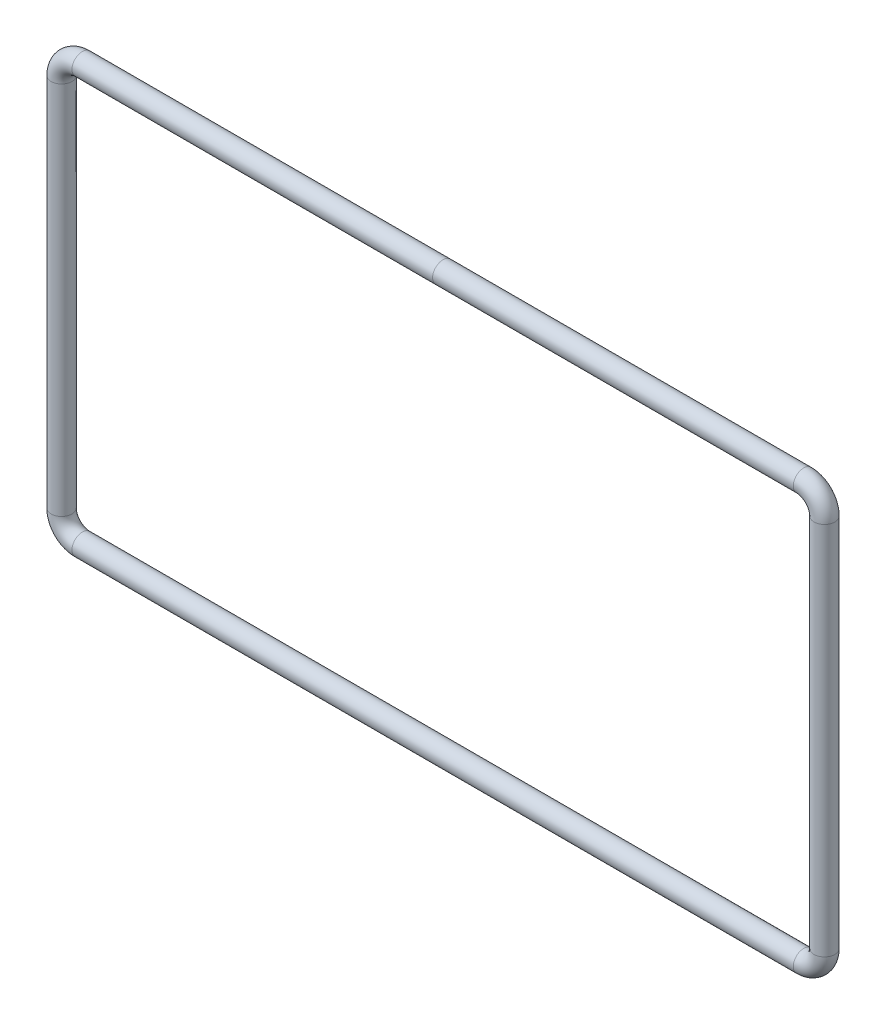
ISO-10303-21;
HEADER;
FILE_DESCRIPTION(('STEP AP214'),'2;1');
FILE_NAME('part.step','',(''),(''),'','','');
FILE_SCHEMA(('AUTOMOTIVE_DESIGN { 1 0 10303 214 1 1 1 1 }'));
ENDSEC;
DATA;
#1=APPLICATION_CONTEXT('core data for automotive mechanical design processes');
#2=APPLICATION_PROTOCOL_DEFINITION('international standard','automotive_design',2000,#1);
#3=PRODUCT_CONTEXT('',#1,'mechanical');
#4=PRODUCT('Part','Part','',(#3));
#5=PRODUCT_RELATED_PRODUCT_CATEGORY('part','',(#4));
#6=PRODUCT_DEFINITION_FORMATION('','',#4);
#7=PRODUCT_DEFINITION_CONTEXT('part definition',#1,'design');
#8=PRODUCT_DEFINITION('design','',#6,#7);
#9=PRODUCT_DEFINITION_SHAPE('','',#8);
#10=(LENGTH_UNIT() NAMED_UNIT(*) SI_UNIT(.MILLI.,.METRE.));
#11=(NAMED_UNIT(*) PLANE_ANGLE_UNIT() SI_UNIT($,.RADIAN.));
#12=(NAMED_UNIT(*) SI_UNIT($,.STERADIAN.) SOLID_ANGLE_UNIT());
#13=UNCERTAINTY_MEASURE_WITH_UNIT(LENGTH_MEASURE(1.E-05),#10,'distance_accuracy_value','');
#14=(GEOMETRIC_REPRESENTATION_CONTEXT(3) GLOBAL_UNCERTAINTY_ASSIGNED_CONTEXT((#13)) GLOBAL_UNIT_ASSIGNED_CONTEXT((#10,
#11,#12)) REPRESENTATION_CONTEXT('',''));
#15=CARTESIAN_POINT('',(0.,0.,0.));
#16=DIRECTION('',(0.,0.,1.));
#17=DIRECTION('',(1.,0.,0.));
#18=AXIS2_PLACEMENT_3D('',#15,#16,#17);
#19=CARTESIAN_POINT('',(-72.8,42.,0.));
#20=DIRECTION('',(1.,0.,0.));
#21=DIRECTION('',(0.,1.,0.));
#22=AXIS2_PLACEMENT_3D('',#19,#20,#21);
#23=CYLINDRICAL_SURFACE('',#22,2.1);
#24=CARTESIAN_POINT('',(0.,42.,0.));
#25=DIRECTION('',(1.,0.,0.));
#26=DIRECTION('',(0.,0.,-1.));
#27=AXIS2_PLACEMENT_3D('',#24,#25,#26);
#28=CIRCLE('',#27,2.1);
#29=CARTESIAN_POINT('',(0.,42.,-2.1));
#30=VERTEX_POINT('',#29);
#31=EDGE_CURVE('E64',#30,#30,#28,.T.);
#32=ORIENTED_EDGE('',*,*,#31,.F.);
#33=EDGE_LOOP('',(#32));
#34=FACE_BOUND('',#33,.T.);
#35=CARTESIAN_POINT('',(-72.8,42.,0.));
#36=DIRECTION('',(1.,0.,0.));
#37=DIRECTION('',(0.,0.,-1.));
#38=AXIS2_PLACEMENT_3D('',#35,#36,#37);
#39=CIRCLE('',#38,2.1);
#40=CARTESIAN_POINT('',(-72.8,44.1,0.));
#41=VERTEX_POINT('',#40);
#42=EDGE_CURVE('E10',#41,#41,#39,.T.);
#43=ORIENTED_EDGE('',*,*,#42,.T.);
#44=EDGE_LOOP('',(#43));
#45=FACE_BOUND('',#44,.T.);
#46=ADVANCED_FACE('F33',(#34,#45),#23,.T.);
#47=CARTESIAN_POINT('',(-72.8,37.8,0.));
#48=DIRECTION('',(0.,0.,-1.));
#49=DIRECTION('',(-1.,0.,0.));
#50=AXIS2_PLACEMENT_3D('',#47,#48,#49);
#51=TOROIDAL_SURFACE('',#50,4.20000000000001,2.1);
#52=CARTESIAN_POINT('',(-77.,37.8,0.));
#53=DIRECTION('',(0.,1.,0.));
#54=DIRECTION('',(0.,0.,-1.));
#55=AXIS2_PLACEMENT_3D('',#52,#53,#54);
#56=CIRCLE('',#55,2.1);
#57=CARTESIAN_POINT('',(-79.1,37.8,0.));
#58=VERTEX_POINT('',#57);
#59=EDGE_CURVE('E39',#58,#58,#56,.T.);
#60=CARTESIAN_POINT('',(-72.8,37.8,0.));
#61=DIRECTION('',(0.,0.,-1.));
#62=DIRECTION('',(-1.,0.,0.));
#63=AXIS2_PLACEMENT_3D('',#60,#61,#62);
#64=CIRCLE('',#63,6.30000000000001);
#65=EDGE_CURVE('',#58,#41,#64,.T.);
#66=ORIENTED_EDGE('',*,*,#59,.T.);
#67=ORIENTED_EDGE('',*,*,#42,.F.);
#68=ORIENTED_EDGE('',*,*,#65,.T.);
#69=ORIENTED_EDGE('',*,*,#65,.F.);
#70=EDGE_LOOP('',(#66,#68,#67,#69));
#71=FACE_BOUND('',#70,.T.);
#72=ADVANCED_FACE('F71',(#71),#51,.T.);
#73=CARTESIAN_POINT('',(-77.,-37.8,0.));
#74=DIRECTION('',(0.,1.,0.));
#75=DIRECTION('',(-1.,0.,0.));
#76=AXIS2_PLACEMENT_3D('',#73,#74,#75);
#77=CYLINDRICAL_SURFACE('',#76,2.1);
#78=ORIENTED_EDGE('',*,*,#59,.F.);
#79=EDGE_LOOP('',(#78));
#80=FACE_BOUND('',#79,.T.);
#81=CARTESIAN_POINT('',(-77.,-37.8,0.));
#82=DIRECTION('',(0.,1.,0.));
#83=DIRECTION('',(0.,0.,-1.));
#84=AXIS2_PLACEMENT_3D('',#81,#82,#83);
#85=CIRCLE('',#84,2.1);
#86=CARTESIAN_POINT('',(-79.1,-37.8,0.));
#87=VERTEX_POINT('',#86);
#88=EDGE_CURVE('E43',#87,#87,#85,.T.);
#89=ORIENTED_EDGE('',*,*,#88,.T.);
#90=EDGE_LOOP('',(#89));
#91=FACE_BOUND('',#90,.T.);
#92=ADVANCED_FACE('F75',(#80,#91),#77,.T.);
#93=CARTESIAN_POINT('',(-72.8,-37.8,0.));
#94=DIRECTION('',(0.,0.,-1.));
#95=DIRECTION('',(-1.,0.,0.));
#96=AXIS2_PLACEMENT_3D('',#93,#94,#95);
#97=TOROIDAL_SURFACE('',#96,4.2,2.1);
#98=CARTESIAN_POINT('',(-72.8,-42.,0.));
#99=DIRECTION('',(-1.,0.,0.));
#100=DIRECTION('',(0.,0.,-1.));
#101=AXIS2_PLACEMENT_3D('',#98,#99,#100);
#102=CIRCLE('',#101,2.1);
#103=CARTESIAN_POINT('',(-72.8,-44.1,0.));
#104=VERTEX_POINT('',#103);
#105=EDGE_CURVE('E47',#104,#104,#102,.T.);
#106=CARTESIAN_POINT('',(-72.8,-37.8,0.));
#107=DIRECTION('',(0.,0.,-1.));
#108=DIRECTION('',(-1.,0.,0.));
#109=AXIS2_PLACEMENT_3D('',#106,#107,#108);
#110=CIRCLE('',#109,6.29999999999999);
#111=EDGE_CURVE('',#104,#87,#110,.T.);
#112=ORIENTED_EDGE('',*,*,#105,.T.);
#113=ORIENTED_EDGE('',*,*,#88,.F.);
#114=ORIENTED_EDGE('',*,*,#111,.T.);
#115=ORIENTED_EDGE('',*,*,#111,.F.);
#116=EDGE_LOOP('',(#112,#114,#113,#115));
#117=FACE_BOUND('',#116,.T.);
#118=ADVANCED_FACE('F80',(#117),#97,.T.);
#119=CARTESIAN_POINT('',(72.8,-42.,0.));
#120=DIRECTION('',(-1.,0.,0.));
#121=DIRECTION('',(0.,0.,1.));
#122=AXIS2_PLACEMENT_3D('',#119,#120,#121);
#123=CYLINDRICAL_SURFACE('',#122,2.1);
#124=ORIENTED_EDGE('',*,*,#105,.F.);
#125=EDGE_LOOP('',(#124));
#126=FACE_BOUND('',#125,.T.);
#127=CARTESIAN_POINT('',(72.8,-42.,0.));
#128=DIRECTION('',(-1.,0.,0.));
#129=DIRECTION('',(0.,0.,-1.));
#130=AXIS2_PLACEMENT_3D('',#127,#128,#129);
#131=CIRCLE('',#130,2.1);
#132=CARTESIAN_POINT('',(72.8,-44.1,0.));
#133=VERTEX_POINT('',#132);
#134=EDGE_CURVE('E52',#133,#133,#131,.T.);
#135=ORIENTED_EDGE('',*,*,#134,.T.);
#136=EDGE_LOOP('',(#135));
#137=FACE_BOUND('',#136,.T.);
#138=ADVANCED_FACE('F86',(#126,#137),#123,.T.);
#139=CARTESIAN_POINT('',(72.8,-37.8,0.));
#140=DIRECTION('',(0.,0.,-1.));
#141=DIRECTION('',(-1.,0.,0.));
#142=AXIS2_PLACEMENT_3D('',#139,#140,#141);
#143=TOROIDAL_SURFACE('',#142,4.2,2.1);
#144=CARTESIAN_POINT('',(77.,-37.8,0.));
#145=DIRECTION('',(0.,-1.,0.));
#146=DIRECTION('',(0.,0.,-1.));
#147=AXIS2_PLACEMENT_3D('',#144,#145,#146);
#148=CIRCLE('',#147,2.1);
#149=CARTESIAN_POINT('',(79.1,-37.8,0.));
#150=VERTEX_POINT('',#149);
#151=EDGE_CURVE('E55',#150,#150,#148,.T.);
#152=CARTESIAN_POINT('',(72.8,-37.8,0.));
#153=DIRECTION('',(0.,0.,-1.));
#154=DIRECTION('',(-1.,0.,0.));
#155=AXIS2_PLACEMENT_3D('',#152,#153,#154);
#156=CIRCLE('',#155,6.29999999999999);
#157=EDGE_CURVE('',#150,#133,#156,.T.);
#158=ORIENTED_EDGE('',*,*,#151,.T.);
#159=ORIENTED_EDGE('',*,*,#134,.F.);
#160=ORIENTED_EDGE('',*,*,#157,.T.);
#161=ORIENTED_EDGE('',*,*,#157,.F.);
#162=EDGE_LOOP('',(#158,#160,#159,#161));
#163=FACE_BOUND('',#162,.T.);
#164=ADVANCED_FACE('F90',(#163),#143,.T.);
#165=CARTESIAN_POINT('',(77.,37.8,0.));
#166=DIRECTION('',(0.,-1.,0.));
#167=DIRECTION('',(0.,0.,-1.));
#168=AXIS2_PLACEMENT_3D('',#165,#166,#167);
#169=CYLINDRICAL_SURFACE('',#168,2.1);
#170=ORIENTED_EDGE('',*,*,#151,.F.);
#171=EDGE_LOOP('',(#170));
#172=FACE_BOUND('',#171,.T.);
#173=CARTESIAN_POINT('',(77.,37.8,0.));
#174=DIRECTION('',(0.,-1.,0.));
#175=DIRECTION('',(0.,0.,-1.));
#176=AXIS2_PLACEMENT_3D('',#173,#174,#175);
#177=CIRCLE('',#176,2.1);
#178=CARTESIAN_POINT('',(79.1,37.8,0.));
#179=VERTEX_POINT('',#178);
#180=EDGE_CURVE('E58',#179,#179,#177,.T.);
#181=ORIENTED_EDGE('',*,*,#180,.T.);
#182=EDGE_LOOP('',(#181));
#183=FACE_BOUND('',#182,.T.);
#184=ADVANCED_FACE('F94',(#172,#183),#169,.T.);
#185=CARTESIAN_POINT('',(72.8,37.8,0.));
#186=DIRECTION('',(0.,0.,-1.));
#187=DIRECTION('',(-1.,0.,0.));
#188=AXIS2_PLACEMENT_3D('',#185,#186,#187);
#189=TOROIDAL_SURFACE('',#188,4.2,2.1);
#190=CARTESIAN_POINT('',(72.8,42.,0.));
#191=DIRECTION('',(1.,0.,0.));
#192=DIRECTION('',(0.,0.,-1.));
#193=AXIS2_PLACEMENT_3D('',#190,#191,#192);
#194=CIRCLE('',#193,2.1);
#195=CARTESIAN_POINT('',(72.8,44.1,0.));
#196=VERTEX_POINT('',#195);
#197=EDGE_CURVE('E61',#196,#196,#194,.T.);
#198=CARTESIAN_POINT('',(72.8,37.8,0.));
#199=DIRECTION('',(0.,0.,-1.));
#200=DIRECTION('',(-1.,0.,0.));
#201=AXIS2_PLACEMENT_3D('',#198,#199,#200);
#202=CIRCLE('',#201,6.29999999999999);
#203=EDGE_CURVE('',#196,#179,#202,.T.);
#204=ORIENTED_EDGE('',*,*,#197,.T.);
#205=ORIENTED_EDGE('',*,*,#180,.F.);
#206=ORIENTED_EDGE('',*,*,#203,.T.);
#207=ORIENTED_EDGE('',*,*,#203,.F.);
#208=EDGE_LOOP('',(#204,#206,#205,#207));
#209=FACE_BOUND('',#208,.T.);
#210=ADVANCED_FACE('F98',(#209),#189,.T.);
#211=CARTESIAN_POINT('',(0.,42.,0.));
#212=DIRECTION('',(1.,0.,0.));
#213=DIRECTION('',(0.,1.,0.));
#214=AXIS2_PLACEMENT_3D('',#211,#212,#213);
#215=CYLINDRICAL_SURFACE('',#214,2.1);
#216=ORIENTED_EDGE('',*,*,#197,.F.);
#217=EDGE_LOOP('',(#216));
#218=FACE_BOUND('',#217,.T.);
#219=ORIENTED_EDGE('',*,*,#31,.T.);
#220=EDGE_LOOP('',(#219));
#221=FACE_BOUND('',#220,.T.);
#222=ADVANCED_FACE('F68',(#218,#221),#215,.T.);
#223=CLOSED_SHELL('',(#46,#72,#92,#118,#138,#164,#184,#210,#222));
#224=MANIFOLD_SOLID_BREP('B2',#223);
#225=ADVANCED_BREP_SHAPE_REPRESENTATION('',(#18,#224),#14);
#226=SHAPE_DEFINITION_REPRESENTATION(#9,#225);
ENDSEC;
END-ISO-10303-21;
